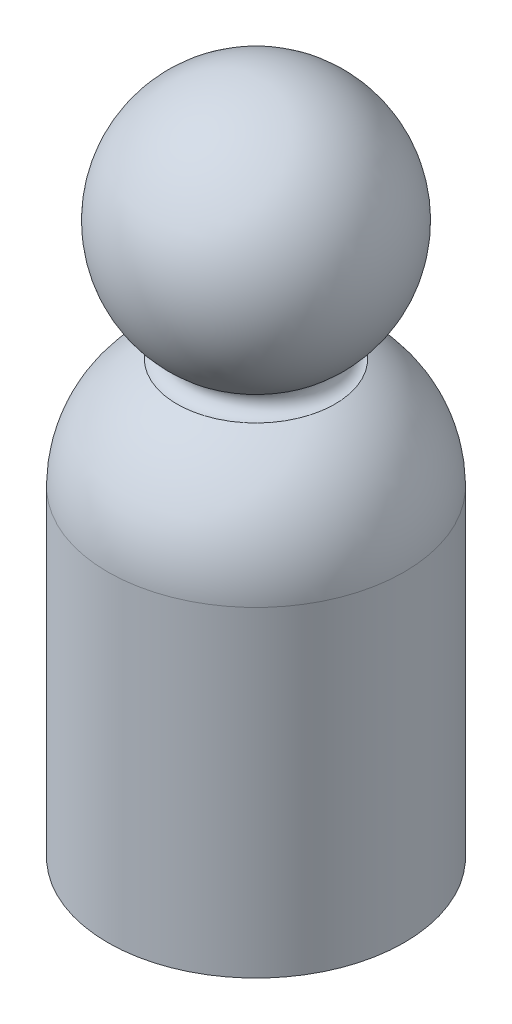
ISO-10303-21;
HEADER;
FILE_DESCRIPTION(('STEP AP214'),'2;1');
FILE_NAME('part.step','',(''),(''),'','','');
FILE_SCHEMA(('AUTOMOTIVE_DESIGN { 1 0 10303 214 1 1 1 1 }'));
ENDSEC;
DATA;
#1=APPLICATION_CONTEXT('core data for automotive mechanical design processes');
#2=APPLICATION_PROTOCOL_DEFINITION('international standard','automotive_design',2000,#1);
#3=PRODUCT_CONTEXT('',#1,'mechanical');
#4=PRODUCT('Part','Part','',(#3));
#5=PRODUCT_RELATED_PRODUCT_CATEGORY('part','',(#4));
#6=PRODUCT_DEFINITION_FORMATION('','',#4);
#7=PRODUCT_DEFINITION_CONTEXT('part definition',#1,'design');
#8=PRODUCT_DEFINITION('design','',#6,#7);
#9=PRODUCT_DEFINITION_SHAPE('','',#8);
#10=(LENGTH_UNIT() NAMED_UNIT(*) SI_UNIT(.MILLI.,.METRE.));
#11=(NAMED_UNIT(*) PLANE_ANGLE_UNIT() SI_UNIT($,.RADIAN.));
#12=(NAMED_UNIT(*) SI_UNIT($,.STERADIAN.) SOLID_ANGLE_UNIT());
#13=UNCERTAINTY_MEASURE_WITH_UNIT(LENGTH_MEASURE(1.E-05),#10,'distance_accuracy_value','');
#14=(GEOMETRIC_REPRESENTATION_CONTEXT(3) GLOBAL_UNCERTAINTY_ASSIGNED_CONTEXT((#13)) GLOBAL_UNIT_ASSIGNED_CONTEXT((#10,
#11,#12)) REPRESENTATION_CONTEXT('',''));
#15=CARTESIAN_POINT('',(0.,0.,0.));
#16=DIRECTION('',(0.,0.,1.));
#17=DIRECTION('',(1.,0.,0.));
#18=AXIS2_PLACEMENT_3D('',#15,#16,#17);
#19=CARTESIAN_POINT('',(0.,44.6637268131769,0.));
#20=DIRECTION('',(0.,-1.,0.));
#21=DIRECTION('',(1.,0.,0.));
#22=AXIS2_PLACEMENT_3D('',#19,#20,#21);
#23=SPHERICAL_SURFACE('',#22,10.);
#24=CARTESIAN_POINT('',(0.,36.9799777282575,0.));
#25=DIRECTION('',(0.,-1.,0.));
#26=DIRECTION('',(0.,0.,-1.));
#27=AXIS2_PLACEMENT_3D('',#24,#25,#26);
#28=CIRCLE('',#27,6.4);
#29=CARTESIAN_POINT('',(0.,36.9799777282575,-6.4));
#30=VERTEX_POINT('',#29);
#31=EDGE_CURVE('E10',#30,#30,#28,.T.);
#32=ORIENTED_EDGE('',*,*,#31,.F.);
#33=EDGE_LOOP('',(#32));
#34=FACE_BOUND('',#33,.T.);
#35=ADVANCED_FACE('F41',(#34),#23,.T.);
#36=CARTESIAN_POINT('',(0.,35.9799777282575,0.));
#37=DIRECTION('',(0.,-1.,0.));
#38=DIRECTION('',(0.,0.,-1.));
#39=AXIS2_PLACEMENT_3D('',#36,#37,#38);
#40=TOROIDAL_SURFACE('',#39,6.4,1.);
#41=CARTESIAN_POINT('',(0.,34.9799777282575,0.));
#42=DIRECTION('',(0.,-1.,0.));
#43=DIRECTION('',(0.,0.,-1.));
#44=AXIS2_PLACEMENT_3D('',#41,#42,#43);
#45=CIRCLE('',#44,6.4);
#46=CARTESIAN_POINT('',(0.,34.9799777282575,-6.4));
#47=VERTEX_POINT('',#46);
#48=EDGE_CURVE('E48',#47,#47,#45,.T.);
#49=ORIENTED_EDGE('',*,*,#48,.F.);
#50=EDGE_LOOP('',(#49));
#51=FACE_BOUND('',#50,.T.);
#52=ORIENTED_EDGE('',*,*,#31,.T.);
#53=EDGE_LOOP('',(#52));
#54=FACE_BOUND('',#53,.T.);
#55=ADVANCED_FACE('F76',(#51,#54),#40,.F.);
#56=CARTESIAN_POINT('',(0.,26.,0.));
#57=DIRECTION('',(0.,-1.,0.));
#58=DIRECTION('',(0.,0.,-1.));
#59=AXIS2_PLACEMENT_3D('',#56,#57,#58);
#60=DEGENERATE_TOROIDAL_SURFACE('',#59,2.,10.,.T.);
#61=CARTESIAN_POINT('',(0.,26.,0.));
#62=DIRECTION('',(0.,-1.,0.));
#63=DIRECTION('',(0.,0.,-1.));
#64=AXIS2_PLACEMENT_3D('',#61,#62,#63);
#65=CIRCLE('',#64,12.);
#66=CARTESIAN_POINT('',(0.,26.,-12.));
#67=VERTEX_POINT('',#66);
#68=EDGE_CURVE('E53',#67,#67,#65,.T.);
#69=ORIENTED_EDGE('',*,*,#68,.F.);
#70=EDGE_LOOP('',(#69));
#71=FACE_BOUND('',#70,.T.);
#72=ORIENTED_EDGE('',*,*,#48,.T.);
#73=EDGE_LOOP('',(#72));
#74=FACE_BOUND('',#73,.T.);
#75=ADVANCED_FACE('F72',(#71,#74),#60,.T.);
#76=CARTESIAN_POINT('',(0.,0.,0.));
#77=DIRECTION('',(0.,-1.,0.));
#78=DIRECTION('',(0.,0.,-1.));
#79=AXIS2_PLACEMENT_3D('',#76,#77,#78);
#80=CYLINDRICAL_SURFACE('',#79,12.);
#81=CARTESIAN_POINT('',(0.,0.,0.));
#82=DIRECTION('',(0.,-1.,0.));
#83=DIRECTION('',(0.,0.,-1.));
#84=AXIS2_PLACEMENT_3D('',#81,#82,#83);
#85=CIRCLE('',#84,12.);
#86=CARTESIAN_POINT('',(0.,0.,-12.));
#87=VERTEX_POINT('',#86);
#88=EDGE_CURVE('E58',#87,#87,#85,.T.);
#89=ORIENTED_EDGE('',*,*,#88,.F.);
#90=EDGE_LOOP('',(#89));
#91=FACE_BOUND('',#90,.T.);
#92=ORIENTED_EDGE('',*,*,#68,.T.);
#93=EDGE_LOOP('',(#92));
#94=FACE_BOUND('',#93,.T.);
#95=ADVANCED_FACE('F67',(#91,#94),#80,.T.);
#96=CARTESIAN_POINT('',(0.,0.,0.));
#97=DIRECTION('',(0.,1.,0.));
#98=DIRECTION('',(0.,0.,1.));
#99=AXIS2_PLACEMENT_3D('',#96,#97,#98);
#100=PLANE('',#99);
#101=ORIENTED_EDGE('',*,*,#88,.T.);
#102=EDGE_LOOP('',(#101));
#103=FACE_BOUND('',#102,.T.);
#104=ADVANCED_FACE('F70',(#103),#100,.F.);
#105=CLOSED_SHELL('',(#35,#55,#75,#95,#104));
#106=MANIFOLD_SOLID_BREP('B2',#105);
#107=ADVANCED_BREP_SHAPE_REPRESENTATION('',(#18,#106),#14);
#108=SHAPE_DEFINITION_REPRESENTATION(#9,#107);
ENDSEC;
END-ISO-10303-21;
